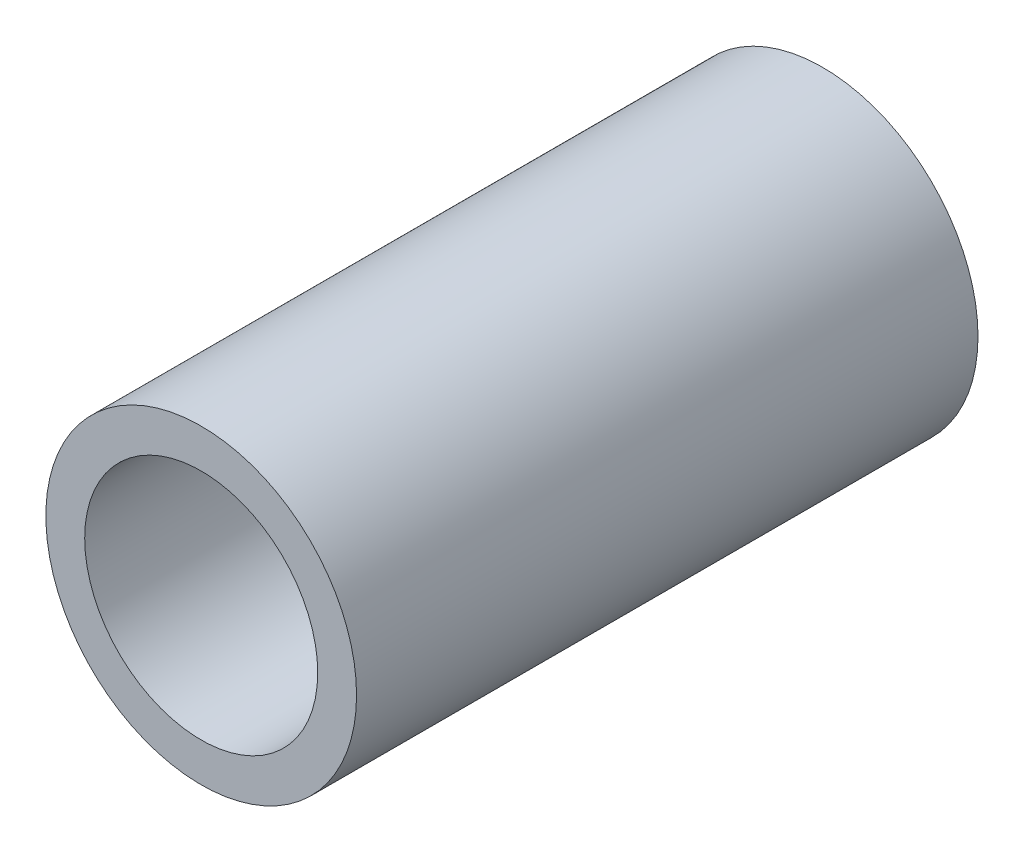
ISO-10303-21;
HEADER;
FILE_DESCRIPTION(('STEP AP214'),'2;1');
FILE_NAME('part.step','',(''),(''),'','','');
FILE_SCHEMA(('AUTOMOTIVE_DESIGN { 1 0 10303 214 1 1 1 1 }'));
ENDSEC;
DATA;
#1=APPLICATION_CONTEXT('core data for automotive mechanical design processes');
#2=APPLICATION_PROTOCOL_DEFINITION('international standard','automotive_design',2000,#1);
#3=PRODUCT_CONTEXT('',#1,'mechanical');
#4=PRODUCT('Part','Part','',(#3));
#5=PRODUCT_RELATED_PRODUCT_CATEGORY('part','',(#4));
#6=PRODUCT_DEFINITION_FORMATION('','',#4);
#7=PRODUCT_DEFINITION_CONTEXT('part definition',#1,'design');
#8=PRODUCT_DEFINITION('design','',#6,#7);
#9=PRODUCT_DEFINITION_SHAPE('','',#8);
#10=(LENGTH_UNIT() NAMED_UNIT(*) SI_UNIT(.MILLI.,.METRE.));
#11=(NAMED_UNIT(*) PLANE_ANGLE_UNIT() SI_UNIT($,.RADIAN.));
#12=(NAMED_UNIT(*) SI_UNIT($,.STERADIAN.) SOLID_ANGLE_UNIT());
#13=UNCERTAINTY_MEASURE_WITH_UNIT(LENGTH_MEASURE(1.E-05),#10,'distance_accuracy_value','');
#14=(GEOMETRIC_REPRESENTATION_CONTEXT(3) GLOBAL_UNCERTAINTY_ASSIGNED_CONTEXT((#13)) GLOBAL_UNIT_ASSIGNED_CONTEXT((#10,
#11,#12)) REPRESENTATION_CONTEXT('',''));
#15=CARTESIAN_POINT('',(0.,0.,0.));
#16=DIRECTION('',(0.,0.,1.));
#17=DIRECTION('',(1.,0.,0.));
#18=AXIS2_PLACEMENT_3D('',#15,#16,#17);
#19=CARTESIAN_POINT('',(0.,0.,25.4));
#20=DIRECTION('',(0.,0.,1.));
#21=DIRECTION('',(1.,0.,0.));
#22=AXIS2_PLACEMENT_3D('',#19,#20,#21);
#23=PLANE('',#22);
#24=CARTESIAN_POINT('',(0.,0.,25.4));
#25=DIRECTION('',(0.,0.,1.));
#26=DIRECTION('',(1.,0.,0.));
#27=AXIS2_PLACEMENT_3D('',#24,#25,#26);
#28=CIRCLE('',#27,6.35);
#29=CARTESIAN_POINT('',(6.35,0.,25.4));
#30=VERTEX_POINT('',#29);
#31=EDGE_CURVE('E10',#30,#30,#28,.T.);
#32=ORIENTED_EDGE('',*,*,#31,.T.);
#33=EDGE_LOOP('',(#32));
#34=FACE_BOUND('',#33,.T.);
#35=CARTESIAN_POINT('',(0.,0.,25.4));
#36=DIRECTION('',(0.,0.,1.));
#37=DIRECTION('',(1.,0.,0.));
#38=AXIS2_PLACEMENT_3D('',#35,#36,#37);
#39=CIRCLE('',#38,4.7625);
#40=CARTESIAN_POINT('',(4.7625,0.,25.4));
#41=VERTEX_POINT('',#40);
#42=EDGE_CURVE('E42',#41,#41,#39,.T.);
#43=ORIENTED_EDGE('',*,*,#42,.F.);
#44=EDGE_LOOP('',(#43));
#45=FACE_BOUND('',#44,.T.);
#46=ADVANCED_FACE('F31',(#34,#45),#23,.T.);
#47=CARTESIAN_POINT('',(0.,0.,0.));
#48=DIRECTION('',(0.,0.,1.));
#49=DIRECTION('',(1.,0.,0.));
#50=AXIS2_PLACEMENT_3D('',#47,#48,#49);
#51=PLANE('',#50);
#52=CARTESIAN_POINT('',(0.,0.,0.));
#53=DIRECTION('',(0.,0.,1.));
#54=DIRECTION('',(1.,0.,0.));
#55=AXIS2_PLACEMENT_3D('',#52,#53,#54);
#56=CIRCLE('',#55,6.35);
#57=CARTESIAN_POINT('',(6.35,0.,0.));
#58=VERTEX_POINT('',#57);
#59=EDGE_CURVE('E35',#58,#58,#56,.T.);
#60=ORIENTED_EDGE('',*,*,#59,.F.);
#61=EDGE_LOOP('',(#60));
#62=FACE_BOUND('',#61,.T.);
#63=CARTESIAN_POINT('',(0.,0.,0.));
#64=DIRECTION('',(0.,0.,1.));
#65=DIRECTION('',(1.,0.,0.));
#66=AXIS2_PLACEMENT_3D('',#63,#64,#65);
#67=CIRCLE('',#66,4.7625);
#68=CARTESIAN_POINT('',(4.7625,0.,0.));
#69=VERTEX_POINT('',#68);
#70=EDGE_CURVE('E44',#69,#69,#67,.T.);
#71=ORIENTED_EDGE('',*,*,#70,.T.);
#72=EDGE_LOOP('',(#71));
#73=FACE_BOUND('',#72,.T.);
#74=ADVANCED_FACE('F54',(#62,#73),#51,.F.);
#75=CARTESIAN_POINT('',(0.,0.,25.4));
#76=DIRECTION('',(0.,0.,-1.));
#77=DIRECTION('',(-1.,0.,0.));
#78=AXIS2_PLACEMENT_3D('',#75,#76,#77);
#79=CYLINDRICAL_SURFACE('',#78,6.35);
#80=ORIENTED_EDGE('',*,*,#31,.F.);
#81=EDGE_LOOP('',(#80));
#82=FACE_BOUND('',#81,.T.);
#83=ORIENTED_EDGE('',*,*,#59,.T.);
#84=EDGE_LOOP('',(#83));
#85=FACE_BOUND('',#84,.T.);
#86=ADVANCED_FACE('F33',(#82,#85),#79,.T.);
#87=CARTESIAN_POINT('',(0.,0.,25.4));
#88=DIRECTION('',(0.,0.,-1.));
#89=DIRECTION('',(-1.,0.,0.));
#90=AXIS2_PLACEMENT_3D('',#87,#88,#89);
#91=CYLINDRICAL_SURFACE('',#90,4.7625);
#92=ORIENTED_EDGE('',*,*,#42,.T.);
#93=EDGE_LOOP('',(#92));
#94=FACE_BOUND('',#93,.T.);
#95=ORIENTED_EDGE('',*,*,#70,.F.);
#96=EDGE_LOOP('',(#95));
#97=FACE_BOUND('',#96,.T.);
#98=ADVANCED_FACE('F50',(#94,#97),#91,.F.);
#99=CLOSED_SHELL('',(#46,#74,#86,#98));
#100=MANIFOLD_SOLID_BREP('B2',#99);
#101=ADVANCED_BREP_SHAPE_REPRESENTATION('',(#18,#100),#14);
#102=SHAPE_DEFINITION_REPRESENTATION(#9,#101);
ENDSEC;
END-ISO-10303-21;
